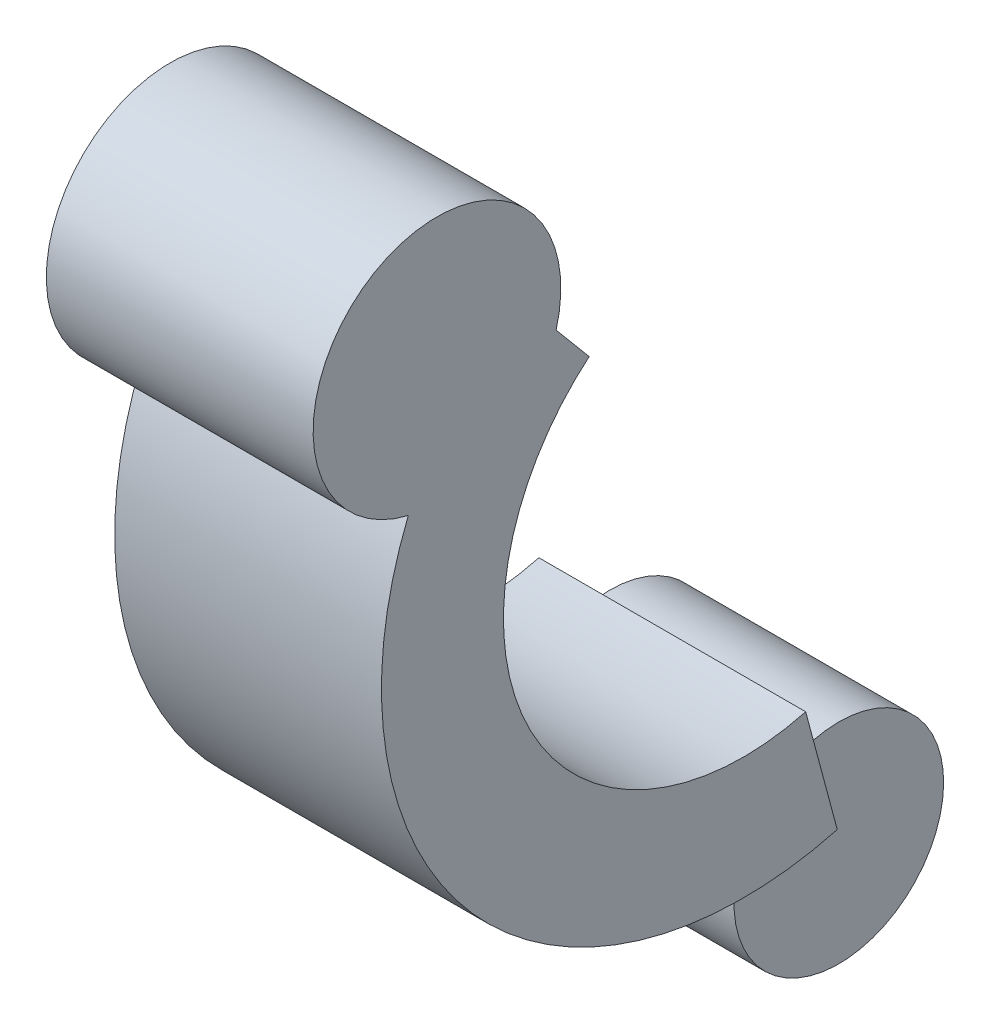
ISO-10303-21;
HEADER;
FILE_DESCRIPTION(('STEP AP214'),'2;1');
FILE_NAME('part.step','',(''),(''),'','','');
FILE_SCHEMA(('AUTOMOTIVE_DESIGN { 1 0 10303 214 1 1 1 1 }'));
ENDSEC;
DATA;
#1=APPLICATION_CONTEXT('core data for automotive mechanical design processes');
#2=APPLICATION_PROTOCOL_DEFINITION('international standard','automotive_design',2000,#1);
#3=PRODUCT_CONTEXT('',#1,'mechanical');
#4=PRODUCT('Part','Part','',(#3));
#5=PRODUCT_RELATED_PRODUCT_CATEGORY('part','',(#4));
#6=PRODUCT_DEFINITION_FORMATION('','',#4);
#7=PRODUCT_DEFINITION_CONTEXT('part definition',#1,'design');
#8=PRODUCT_DEFINITION('design','',#6,#7);
#9=PRODUCT_DEFINITION_SHAPE('','',#8);
#10=(LENGTH_UNIT() NAMED_UNIT(*) SI_UNIT(.MILLI.,.METRE.));
#11=(NAMED_UNIT(*) PLANE_ANGLE_UNIT() SI_UNIT($,.RADIAN.));
#12=(NAMED_UNIT(*) SI_UNIT($,.STERADIAN.) SOLID_ANGLE_UNIT());
#13=UNCERTAINTY_MEASURE_WITH_UNIT(LENGTH_MEASURE(1.E-05),#10,'distance_accuracy_value','');
#14=(GEOMETRIC_REPRESENTATION_CONTEXT(3) GLOBAL_UNCERTAINTY_ASSIGNED_CONTEXT((#13)) GLOBAL_UNIT_ASSIGNED_CONTEXT((#10,
#11,#12)) REPRESENTATION_CONTEXT('',''));
#15=CARTESIAN_POINT('',(0.,0.,0.));
#16=DIRECTION('',(0.,0.,1.));
#17=DIRECTION('',(1.,0.,0.));
#18=AXIS2_PLACEMENT_3D('',#15,#16,#17);
#19=CARTESIAN_POINT('',(7.,0.,0.));
#20=DIRECTION('',(-1.,0.,0.));
#21=DIRECTION('',(0.,0.,1.));
#22=AXIS2_PLACEMENT_3D('',#19,#20,#21);
#23=CYLINDRICAL_SURFACE('',#22,19.);
#24=DIRECTION('',(-1.,0.,0.));
#25=VECTOR('',#24,1.);
#26=CARTESIAN_POINT('',(0.,-18.9907314843906,-0.593395052031301));
#27=LINE('',#26,#25);
#28=CARTESIAN_POINT('',(6.,-18.9907314843906,-0.593395052031301));
#29=VERTEX_POINT('',#28);
#30=CARTESIAN_POINT('',(-6.,-18.9907314843906,-0.5933950520313));
#31=VERTEX_POINT('',#30);
#32=EDGE_CURVE('E47',#29,#31,#27,.T.);
#33=ORIENTED_EDGE('',*,*,#32,.F.);
#34=CARTESIAN_POINT('',(6.,0.,0.));
#35=DIRECTION('',(1.,0.,0.));
#36=DIRECTION('',(0.,0.,-1.));
#37=AXIS2_PLACEMENT_3D('',#34,#35,#36);
#38=CIRCLE('',#37,19.);
#39=CARTESIAN_POINT('',(6.,-18.3525906994923,-4.91756185694789));
#40=VERTEX_POINT('',#39);
#41=EDGE_CURVE('E115',#29,#40,#38,.T.);
#42=ORIENTED_EDGE('',*,*,#41,.T.);
#43=DIRECTION('',(-1.,0.,0.));
#44=VECTOR('',#43,1.);
#45=CARTESIAN_POINT('',(7.,-18.3525906994923,-4.91756185694789));
#46=LINE('',#45,#44);
#47=CARTESIAN_POINT('',(7.,-18.3525906994923,-4.91756185694789));
#48=VERTEX_POINT('',#47);
#49=EDGE_CURVE('E107',#48,#40,#46,.T.);
#50=ORIENTED_EDGE('',*,*,#49,.F.);
#51=CARTESIAN_POINT('',(7.,0.,0.));
#52=DIRECTION('',(1.,0.,0.));
#53=DIRECTION('',(0.,0.,-1.));
#54=AXIS2_PLACEMENT_3D('',#51,#52,#53);
#55=CIRCLE('',#54,19.);
#56=CARTESIAN_POINT('',(7.,7.17542397515055,17.5929898191534));
#57=VERTEX_POINT('',#56);
#58=EDGE_CURVE('E131',#57,#48,#55,.T.);
#59=ORIENTED_EDGE('',*,*,#58,.F.);
#60=DIRECTION('',(-1.,0.,0.));
#61=VECTOR('',#60,1.);
#62=CARTESIAN_POINT('',(0.,7.17542397515055,17.5929898191534));
#63=LINE('',#62,#61);
#64=CARTESIAN_POINT('',(-7.,7.17542397515055,17.5929898191534));
#65=VERTEX_POINT('',#64);
#66=EDGE_CURVE('E127',#65,#57,#63,.F.);
#67=ORIENTED_EDGE('',*,*,#66,.F.);
#68=CARTESIAN_POINT('',(-7.,0.,0.));
#69=DIRECTION('',(1.,0.,0.));
#70=DIRECTION('',(0.,0.,-1.));
#71=AXIS2_PLACEMENT_3D('',#68,#69,#70);
#72=CIRCLE('',#71,19.);
#73=CARTESIAN_POINT('',(-7.,-18.3525906994923,-4.91756185694789));
#74=VERTEX_POINT('',#73);
#75=EDGE_CURVE('E130',#65,#74,#72,.T.);
#76=ORIENTED_EDGE('',*,*,#75,.T.);
#77=CARTESIAN_POINT('',(-6.,-18.3525906994923,-4.91756185694789));
#78=VERTEX_POINT('',#77);
#79=EDGE_CURVE('E154',#78,#74,#46,.T.);
#80=ORIENTED_EDGE('',*,*,#79,.F.);
#81=CARTESIAN_POINT('',(-6.,0.,0.));
#82=DIRECTION('',(1.,0.,0.));
#83=DIRECTION('',(0.,0.,-1.));
#84=AXIS2_PLACEMENT_3D('',#81,#82,#83);
#85=CIRCLE('',#84,19.);
#86=EDGE_CURVE('E52',#31,#78,#85,.T.);
#87=ORIENTED_EDGE('',*,*,#86,.F.);
#88=EDGE_LOOP('',(#33,#42,#50,#59,#67,#76,#80,#87));
#89=FACE_BOUND('',#88,.T.);
#90=ADVANCED_FACE('F33',(#89),#23,.T.);
#91=CARTESIAN_POINT('',(7.,9.65215998329912,8.0991238820504));
#92=DIRECTION('',(0.,-0.642787609686539,0.766044443118978));
#93=DIRECTION('',(0.,-0.766044443118978,-0.642787609686539));
#94=AXIS2_PLACEMENT_3D('',#91,#92,#93);
#95=PLANE('',#94);
#96=DIRECTION('',(-1.,0.,0.));
#97=VECTOR('',#96,1.);
#98=CARTESIAN_POINT('',(7.,11.7206606349172,9.83480201591309));
#99=LINE('',#98,#97);
#100=CARTESIAN_POINT('',(7.,11.7206606349172,9.83480201591309));
#101=VERTEX_POINT('',#100);
#102=CARTESIAN_POINT('',(-7.,11.7206606349172,9.83480201591309));
#103=VERTEX_POINT('',#102);
#104=EDGE_CURVE('E122',#101,#103,#99,.T.);
#105=ORIENTED_EDGE('',*,*,#104,.F.);
#106=DIRECTION('',(0.,0.766044443118978,0.642787609686539));
#107=VECTOR('',#106,1.);
#108=CARTESIAN_POINT('',(7.,9.65215998329912,8.0991238820504));
#109=LINE('',#108,#107);
#110=CARTESIAN_POINT('',(7.,9.65215998329912,8.0991238820504));
#111=VERTEX_POINT('',#110);
#112=EDGE_CURVE('E138',#111,#101,#109,.T.);
#113=ORIENTED_EDGE('',*,*,#112,.F.);
#114=DIRECTION('',(-1.,0.,0.));
#115=VECTOR('',#114,1.);
#116=CARTESIAN_POINT('',(7.,9.65215998329912,8.0991238820504));
#117=LINE('',#116,#115);
#118=CARTESIAN_POINT('',(-7.,9.65215998329912,8.0991238820504));
#119=VERTEX_POINT('',#118);
#120=EDGE_CURVE('E141',#111,#119,#117,.T.);
#121=ORIENTED_EDGE('',*,*,#120,.T.);
#122=DIRECTION('',(0.,0.766044443118978,0.642787609686539));
#123=VECTOR('',#122,1.);
#124=CARTESIAN_POINT('',(-7.,9.65215998329912,8.0991238820504));
#125=LINE('',#124,#123);
#126=EDGE_CURVE('E134',#119,#103,#125,.T.);
#127=ORIENTED_EDGE('',*,*,#126,.T.);
#128=EDGE_LOOP('',(#105,#113,#121,#127));
#129=FACE_BOUND('',#128,.T.);
#130=ADVANCED_FACE('F171',(#129),#95,.F.);
#131=CARTESIAN_POINT('',(7.,-18.3525906994923,-4.91756185694789));
#132=DIRECTION('',(0.,-0.25881904510252,0.965925826289069));
#133=DIRECTION('',(0.,-0.965925826289069,-0.25881904510252));
#134=AXIS2_PLACEMENT_3D('',#131,#132,#133);
#135=PLANE('',#134);
#136=ORIENTED_EDGE('',*,*,#49,.T.);
#137=DIRECTION('',(0.,0.965925826289069,0.25881904510252));
#138=VECTOR('',#137,1.);
#139=CARTESIAN_POINT('',(6.,-18.3525906994923,-4.91756185694789));
#140=LINE('',#139,#138);
#141=CARTESIAN_POINT('',(6.,-14.8814341813184,-3.98746827110117));
#142=VERTEX_POINT('',#141);
#143=EDGE_CURVE('E11',#40,#142,#140,.T.);
#144=ORIENTED_EDGE('',*,*,#143,.T.);
#145=DIRECTION('',(-1.,0.,0.));
#146=VECTOR('',#145,1.);
#147=CARTESIAN_POINT('',(6.,-14.8814341813184,-3.98746827110117));
#148=LINE('',#147,#146);
#149=CARTESIAN_POINT('',(-6.,-14.8814341813184,-3.98746827110117));
#150=VERTEX_POINT('',#149);
#151=EDGE_CURVE('E40',#150,#142,#148,.F.);
#152=ORIENTED_EDGE('',*,*,#151,.F.);
#153=DIRECTION('',(0.,0.965925826289069,0.25881904510252));
#154=VECTOR('',#153,1.);
#155=CARTESIAN_POINT('',(-6.,-18.3525906994923,-4.91756185694789));
#156=LINE('',#155,#154);
#157=EDGE_CURVE('E97',#78,#150,#156,.T.);
#158=ORIENTED_EDGE('',*,*,#157,.F.);
#159=ORIENTED_EDGE('',*,*,#79,.T.);
#160=DIRECTION('',(0.,0.965925826289068,0.25881904510252));
#161=VECTOR('',#160,1.);
#162=CARTESIAN_POINT('',(-7.,-18.3525906994923,-4.91756185694789));
#163=LINE('',#162,#161);
#164=CARTESIAN_POINT('',(-7.,-12.1706654112423,-3.26111996829176));
#165=VERTEX_POINT('',#164);
#166=EDGE_CURVE('E144',#74,#165,#163,.T.);
#167=ORIENTED_EDGE('',*,*,#166,.T.);
#168=DIRECTION('',(-1.,0.,0.));
#169=VECTOR('',#168,1.);
#170=CARTESIAN_POINT('',(7.,-12.1706654112423,-3.26111996829176));
#171=LINE('',#170,#169);
#172=CARTESIAN_POINT('',(7.,-12.1706654112423,-3.26111996829176));
#173=VERTEX_POINT('',#172);
#174=EDGE_CURVE('E151',#173,#165,#171,.T.);
#175=ORIENTED_EDGE('',*,*,#174,.F.);
#176=DIRECTION('',(0.,0.965925826289068,0.25881904510252));
#177=VECTOR('',#176,1.);
#178=CARTESIAN_POINT('',(7.,-18.3525906994923,-4.91756185694789));
#179=LINE('',#178,#177);
#180=EDGE_CURVE('E133',#48,#173,#179,.T.);
#181=ORIENTED_EDGE('',*,*,#180,.F.);
#182=EDGE_LOOP('',(#136,#144,#152,#158,#159,#167,#175,#181));
#183=FACE_BOUND('',#182,.T.);
#184=ADVANCED_FACE('F96',(#183),#135,.F.);
#185=CARTESIAN_POINT('',(7.,0.,0.));
#186=DIRECTION('',(-1.,0.,0.));
#187=DIRECTION('',(0.,0.,1.));
#188=AXIS2_PLACEMENT_3D('',#185,#186,#187);
#189=CYLINDRICAL_SURFACE('',#188,12.6);
#190=CARTESIAN_POINT('',(-7.,0.,0.));
#191=DIRECTION('',(-1.,0.,0.));
#192=DIRECTION('',(0.,0.,-1.));
#193=AXIS2_PLACEMENT_3D('',#190,#191,#192);
#194=CIRCLE('',#193,12.6);
#195=EDGE_CURVE('E146',#165,#119,#194,.T.);
#196=ORIENTED_EDGE('',*,*,#195,.T.);
#197=ORIENTED_EDGE('',*,*,#120,.F.);
#198=CARTESIAN_POINT('',(7.,0.,0.));
#199=DIRECTION('',(-1.,0.,0.));
#200=DIRECTION('',(0.,0.,-1.));
#201=AXIS2_PLACEMENT_3D('',#198,#199,#200);
#202=CIRCLE('',#201,12.6);
#203=EDGE_CURVE('E136',#173,#111,#202,.T.);
#204=ORIENTED_EDGE('',*,*,#203,.F.);
#205=ORIENTED_EDGE('',*,*,#174,.T.);
#206=EDGE_LOOP('',(#196,#197,#204,#205));
#207=FACE_BOUND('',#206,.T.);
#208=ADVANCED_FACE('F167',(#207),#189,.F.);
#209=CARTESIAN_POINT('',(7.,0.,0.));
#210=DIRECTION('',(1.,0.,0.));
#211=DIRECTION('',(0.,0.,-1.));
#212=AXIS2_PLACEMENT_3D('',#209,#210,#211);
#213=PLANE('',#212);
#214=CARTESIAN_POINT('',(7.,13.4985398034173,16.0869333054985));
#215=DIRECTION('',(1.,0.,0.));
#216=DIRECTION('',(0.,0.,-1.));
#217=AXIS2_PLACEMENT_3D('',#214,#215,#216);
#218=CIRCLE('',#217,6.5);
#219=EDGE_CURVE('E119',#101,#57,#218,.T.);
#220=ORIENTED_EDGE('',*,*,#219,.T.);
#221=ORIENTED_EDGE('',*,*,#58,.T.);
#222=ORIENTED_EDGE('',*,*,#180,.T.);
#223=ORIENTED_EDGE('',*,*,#203,.T.);
#224=ORIENTED_EDGE('',*,*,#112,.T.);
#225=EDGE_LOOP('',(#220,#221,#222,#223,#224));
#226=FACE_BOUND('',#225,.T.);
#227=ADVANCED_FACE('F174',(#226),#213,.T.);
#228=CARTESIAN_POINT('',(-7.,0.,0.));
#229=DIRECTION('',(1.,0.,0.));
#230=DIRECTION('',(0.,0.,-1.));
#231=AXIS2_PLACEMENT_3D('',#228,#229,#230);
#232=PLANE('',#231);
#233=ORIENTED_EDGE('',*,*,#75,.F.);
#234=CARTESIAN_POINT('',(-7.,13.4985398034173,16.0869333054985));
#235=DIRECTION('',(1.,0.,0.));
#236=DIRECTION('',(0.,0.,-1.));
#237=AXIS2_PLACEMENT_3D('',#234,#235,#236);
#238=CIRCLE('',#237,6.5);
#239=EDGE_CURVE('E118',#103,#65,#238,.T.);
#240=ORIENTED_EDGE('',*,*,#239,.F.);
#241=ORIENTED_EDGE('',*,*,#126,.F.);
#242=ORIENTED_EDGE('',*,*,#195,.F.);
#243=ORIENTED_EDGE('',*,*,#166,.F.);
#244=EDGE_LOOP('',(#233,#240,#241,#242,#243));
#245=FACE_BOUND('',#244,.T.);
#246=ADVANCED_FACE('F163',(#245),#232,.F.);
#247=CARTESIAN_POINT('',(7.,13.4985398034173,16.0869333054985));
#248=DIRECTION('',(-1.,0.,0.));
#249=DIRECTION('',(0.,0.,1.));
#250=AXIS2_PLACEMENT_3D('',#247,#248,#249);
#251=CYLINDRICAL_SURFACE('',#250,6.5);
#252=ORIENTED_EDGE('',*,*,#239,.T.);
#253=ORIENTED_EDGE('',*,*,#66,.T.);
#254=ORIENTED_EDGE('',*,*,#219,.F.);
#255=ORIENTED_EDGE('',*,*,#104,.T.);
#256=EDGE_LOOP('',(#252,#253,#254,#255));
#257=FACE_BOUND('',#256,.T.);
#258=ADVANCED_FACE('F176',(#257),#251,.T.);
#259=CARTESIAN_POINT('',(6.,-20.,-6.));
#260=DIRECTION('',(-1.,0.,0.));
#261=DIRECTION('',(0.,0.,1.));
#262=AXIS2_PLACEMENT_3D('',#259,#260,#261);
#263=CYLINDRICAL_SURFACE('',#262,5.5);
#264=CARTESIAN_POINT('',(6.,-20.,-6.));
#265=DIRECTION('',(1.,0.,0.));
#266=DIRECTION('',(0.,0.,-1.));
#267=AXIS2_PLACEMENT_3D('',#264,#265,#266);
#268=CIRCLE('',#267,5.5);
#269=EDGE_CURVE('E110',#29,#142,#268,.T.);
#270=ORIENTED_EDGE('',*,*,#269,.F.);
#271=ORIENTED_EDGE('',*,*,#32,.T.);
#272=CARTESIAN_POINT('',(-6.,-20.,-6.));
#273=DIRECTION('',(1.,0.,0.));
#274=DIRECTION('',(0.,0.,-1.));
#275=AXIS2_PLACEMENT_3D('',#272,#273,#274);
#276=CIRCLE('',#275,5.5);
#277=EDGE_CURVE('E106',#31,#150,#276,.T.);
#278=ORIENTED_EDGE('',*,*,#277,.T.);
#279=ORIENTED_EDGE('',*,*,#151,.T.);
#280=EDGE_LOOP('',(#270,#271,#278,#279));
#281=FACE_BOUND('',#280,.T.);
#282=ADVANCED_FACE('F109',(#281),#263,.T.);
#283=CARTESIAN_POINT('',(6.,-20.,-6.));
#284=DIRECTION('',(1.,0.,0.));
#285=DIRECTION('',(0.,0.,-1.));
#286=AXIS2_PLACEMENT_3D('',#283,#284,#285);
#287=PLANE('',#286);
#288=ORIENTED_EDGE('',*,*,#41,.F.);
#289=ORIENTED_EDGE('',*,*,#269,.T.);
#290=ORIENTED_EDGE('',*,*,#143,.F.);
#291=EDGE_LOOP('',(#288,#289,#290));
#292=FACE_BOUND('',#291,.T.);
#293=ADVANCED_FACE('F183',(#292),#287,.T.);
#294=CARTESIAN_POINT('',(-6.,-20.,-6.));
#295=DIRECTION('',(1.,0.,0.));
#296=DIRECTION('',(0.,0.,-1.));
#297=AXIS2_PLACEMENT_3D('',#294,#295,#296);
#298=PLANE('',#297);
#299=ORIENTED_EDGE('',*,*,#277,.F.);
#300=ORIENTED_EDGE('',*,*,#86,.T.);
#301=ORIENTED_EDGE('',*,*,#157,.T.);
#302=EDGE_LOOP('',(#299,#300,#301));
#303=FACE_BOUND('',#302,.T.);
#304=ADVANCED_FACE('F105',(#303),#298,.F.);
#305=CLOSED_SHELL('',(#90,#130,#184,#208,#227,#246,#258,#282,#293,#304));
#306=MANIFOLD_SOLID_BREP('B2',#305);
#307=ADVANCED_BREP_SHAPE_REPRESENTATION('',(#18,#306),#14);
#308=SHAPE_DEFINITION_REPRESENTATION(#9,#307);
ENDSEC;
END-ISO-10303-21;
